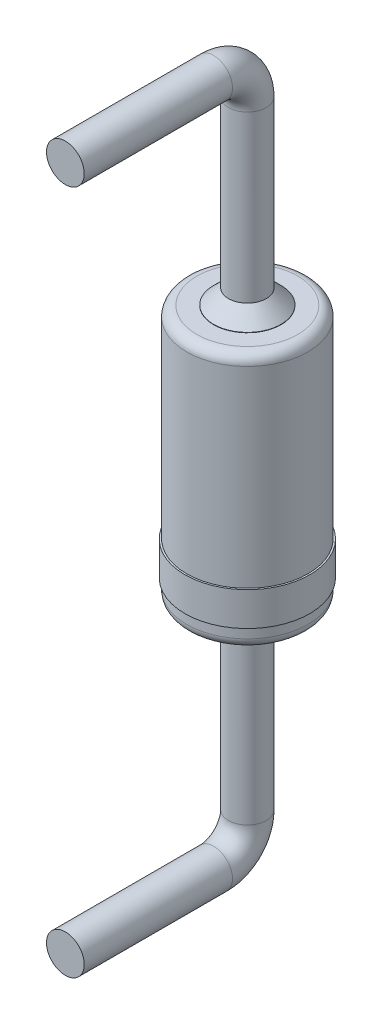
ISO-10303-21;
HEADER;
FILE_DESCRIPTION(('STEP AP214'),'2;1');
FILE_NAME('part.step','',(''),(''),'','','');
FILE_SCHEMA(('AUTOMOTIVE_DESIGN { 1 0 10303 214 1 1 1 1 }'));
ENDSEC;
DATA;
#1=APPLICATION_CONTEXT('core data for automotive mechanical design processes');
#2=APPLICATION_PROTOCOL_DEFINITION('international standard','automotive_design',2000,#1);
#3=PRODUCT_CONTEXT('',#1,'mechanical');
#4=PRODUCT('Part','Part','',(#3));
#5=PRODUCT_RELATED_PRODUCT_CATEGORY('part','',(#4));
#6=PRODUCT_DEFINITION_FORMATION('','',#4);
#7=PRODUCT_DEFINITION_CONTEXT('part definition',#1,'design');
#8=PRODUCT_DEFINITION('design','',#6,#7);
#9=PRODUCT_DEFINITION_SHAPE('','',#8);
#10=(LENGTH_UNIT() NAMED_UNIT(*) SI_UNIT(.MILLI.,.METRE.));
#11=(NAMED_UNIT(*) PLANE_ANGLE_UNIT() SI_UNIT($,.RADIAN.));
#12=(NAMED_UNIT(*) SI_UNIT($,.STERADIAN.) SOLID_ANGLE_UNIT());
#13=UNCERTAINTY_MEASURE_WITH_UNIT(LENGTH_MEASURE(1.E-05),#10,'distance_accuracy_value','');
#14=(GEOMETRIC_REPRESENTATION_CONTEXT(3) GLOBAL_UNCERTAINTY_ASSIGNED_CONTEXT((#13)) GLOBAL_UNIT_ASSIGNED_CONTEXT((#10,
#11,#12)) REPRESENTATION_CONTEXT('',''));
#15=CARTESIAN_POINT('',(0.,0.,0.));
#16=DIRECTION('',(0.,0.,1.));
#17=DIRECTION('',(1.,0.,0.));
#18=AXIS2_PLACEMENT_3D('',#15,#16,#17);
#19=CARTESIAN_POINT('',(0.,0.3,0.));
#20=DIRECTION('',(0.,1.,0.));
#21=DIRECTION('',(0.,0.,1.));
#22=AXIS2_PLACEMENT_3D('',#19,#20,#21);
#23=CYLINDRICAL_SURFACE('',#22,0.925);
#24=CARTESIAN_POINT('',(0.,0.3,0.));
#25=DIRECTION('',(0.,1.,0.));
#26=DIRECTION('',(0.,0.,1.));
#27=AXIS2_PLACEMENT_3D('',#24,#25,#26);
#28=CIRCLE('',#27,0.925);
#29=CARTESIAN_POINT('',(0.,0.3,0.925));
#30=VERTEX_POINT('',#29);
#31=EDGE_CURVE('E12',#30,#30,#28,.T.);
#32=ORIENTED_EDGE('',*,*,#31,.T.);
#33=EDGE_LOOP('',(#32));
#34=FACE_BOUND('',#33,.T.);
#35=CARTESIAN_POINT('',(0.,0.8,0.));
#36=DIRECTION('',(0.,1.,0.));
#37=DIRECTION('',(0.,0.,1.));
#38=AXIS2_PLACEMENT_3D('',#35,#36,#37);
#39=CIRCLE('',#38,0.925);
#40=CARTESIAN_POINT('',(0.,0.8,0.925));
#41=VERTEX_POINT('',#40);
#42=EDGE_CURVE('E55',#41,#41,#39,.T.);
#43=ORIENTED_EDGE('',*,*,#42,.F.);
#44=EDGE_LOOP('',(#43));
#45=FACE_BOUND('',#44,.T.);
#46=ADVANCED_FACE('F52',(#34,#45),#23,.T.);
#47=CARTESIAN_POINT('',(0.,0.3,0.));
#48=DIRECTION('',(0.,1.,0.));
#49=DIRECTION('',(0.,0.,1.));
#50=AXIS2_PLACEMENT_3D('',#47,#48,#49);
#51=PLANE('',#50);
#52=CARTESIAN_POINT('',(0.,0.3,0.));
#53=DIRECTION('',(0.,1.,0.));
#54=DIRECTION('',(0.,0.,1.));
#55=AXIS2_PLACEMENT_3D('',#52,#53,#54);
#56=CIRCLE('',#55,0.875);
#57=CARTESIAN_POINT('',(0.,0.3,0.875));
#58=VERTEX_POINT('',#57);
#59=EDGE_CURVE('E62',#58,#58,#56,.T.);
#60=ORIENTED_EDGE('',*,*,#59,.T.);
#61=EDGE_LOOP('',(#60));
#62=FACE_BOUND('',#61,.T.);
#63=ORIENTED_EDGE('',*,*,#31,.F.);
#64=EDGE_LOOP('',(#63));
#65=FACE_BOUND('',#64,.T.);
#66=ADVANCED_FACE('F70',(#62,#65),#51,.F.);
#67=CARTESIAN_POINT('',(0.,0.8,0.));
#68=DIRECTION('',(0.,1.,0.));
#69=DIRECTION('',(0.,0.,1.));
#70=AXIS2_PLACEMENT_3D('',#67,#68,#69);
#71=PLANE('',#70);
#72=CARTESIAN_POINT('',(0.,0.8,0.));
#73=DIRECTION('',(0.,1.,0.));
#74=DIRECTION('',(0.,0.,1.));
#75=AXIS2_PLACEMENT_3D('',#72,#73,#74);
#76=CIRCLE('',#75,0.875);
#77=CARTESIAN_POINT('',(0.,0.8,0.875));
#78=VERTEX_POINT('',#77);
#79=EDGE_CURVE('E64',#78,#78,#76,.T.);
#80=ORIENTED_EDGE('',*,*,#79,.F.);
#81=EDGE_LOOP('',(#80));
#82=FACE_BOUND('',#81,.T.);
#83=ORIENTED_EDGE('',*,*,#42,.T.);
#84=EDGE_LOOP('',(#83));
#85=FACE_BOUND('',#84,.T.);
#86=ADVANCED_FACE('F76',(#82,#85),#71,.T.);
#87=CARTESIAN_POINT('',(0.,0.3,0.));
#88=DIRECTION('',(0.,1.,0.));
#89=DIRECTION('',(0.,0.,1.));
#90=AXIS2_PLACEMENT_3D('',#87,#88,#89);
#91=CYLINDRICAL_SURFACE('',#90,0.875);
#92=ORIENTED_EDGE('',*,*,#59,.F.);
#93=EDGE_LOOP('',(#92));
#94=FACE_BOUND('',#93,.T.);
#95=ORIENTED_EDGE('',*,*,#79,.T.);
#96=EDGE_LOOP('',(#95));
#97=FACE_BOUND('',#96,.T.);
#98=ADVANCED_FACE('F73',(#94,#97),#91,.F.);
#99=CLOSED_SHELL('',(#46,#66,#86,#98));
#100=MANIFOLD_SOLID_BREP('B2',#99);
#101=CARTESIAN_POINT('',(0.,-0.225,0.));
#102=DIRECTION('',(0.,1.,0.));
#103=DIRECTION('',(0.,0.,-1.));
#104=AXIS2_PLACEMENT_3D('',#101,#102,#103);
#105=CYLINDRICAL_SURFACE('',#104,0.5);
#106=CARTESIAN_POINT('',(0.,-0.00499999999999893,0.));
#107=DIRECTION('',(0.,1.,0.));
#108=DIRECTION('',(0.,0.,1.));
#109=AXIS2_PLACEMENT_3D('',#106,#107,#108);
#110=CIRCLE('',#109,0.5);
#111=CARTESIAN_POINT('',(0.,-0.00499999999999893,0.5));
#112=VERTEX_POINT('',#111);
#113=EDGE_CURVE('E51',#112,#112,#110,.F.);
#114=ORIENTED_EDGE('',*,*,#113,.F.);
#115=EDGE_LOOP('',(#114));
#116=FACE_BOUND('',#115,.T.);
#117=CARTESIAN_POINT('',(0.,0.,0.));
#118=DIRECTION('',(0.,1.,0.));
#119=DIRECTION('',(0.,0.,1.));
#120=AXIS2_PLACEMENT_3D('',#117,#118,#119);
#121=CIRCLE('',#120,0.5);
#122=CARTESIAN_POINT('',(0.,0.,0.5));
#123=VERTEX_POINT('',#122);
#124=EDGE_CURVE('E129',#123,#123,#121,.T.);
#125=ORIENTED_EDGE('',*,*,#124,.F.);
#126=EDGE_LOOP('',(#125));
#127=FACE_BOUND('',#126,.T.);
#128=ADVANCED_FACE('F122',(#116,#127),#105,.T.);
#129=CARTESIAN_POINT('',(0.,0.,0.));
#130=DIRECTION('',(0.,-1.,0.));
#131=DIRECTION('',(0.,0.,1.));
#132=AXIS2_PLACEMENT_3D('',#129,#130,#131);
#133=PLANE('',#132);
#134=ORIENTED_EDGE('',*,*,#124,.T.);
#135=EDGE_LOOP('',(#134));
#136=FACE_BOUND('',#135,.T.);
#137=ADVANCED_FACE('F166',(#136),#133,.F.);
#138=CARTESIAN_POINT('',(0.,-0.225,0.));
#139=DIRECTION('',(0.,1.,0.));
#140=DIRECTION('',(0.,0.,-1.));
#141=AXIS2_PLACEMENT_3D('',#138,#139,#140);
#142=CONICAL_SURFACE('',#141,0.28,0.785398163397447);
#143=ORIENTED_EDGE('',*,*,#113,.T.);
#144=EDGE_LOOP('',(#143));
#145=FACE_BOUND('',#144,.T.);
#146=CARTESIAN_POINT('',(0.,-0.225,0.));
#147=DIRECTION('',(0.,1.,0.));
#148=DIRECTION('',(0.,0.,1.));
#149=AXIS2_PLACEMENT_3D('',#146,#147,#148);
#150=CIRCLE('',#149,0.28);
#151=CARTESIAN_POINT('',(0.,-0.225,0.28));
#152=VERTEX_POINT('',#151);
#153=EDGE_CURVE('E145',#152,#152,#150,.T.);
#154=ORIENTED_EDGE('',*,*,#153,.T.);
#155=EDGE_LOOP('',(#154));
#156=FACE_BOUND('',#155,.T.);
#157=ADVANCED_FACE('F124',(#145,#156),#142,.T.);
#158=CARTESIAN_POINT('',(0.,-3.18,2.7));
#159=DIRECTION('',(0.,0.,-1.));
#160=DIRECTION('',(0.,1.,0.));
#161=AXIS2_PLACEMENT_3D('',#158,#159,#160);
#162=PLANE('',#161);
#163=CARTESIAN_POINT('',(0.,-3.18,2.7));
#164=DIRECTION('',(0.,0.,-1.));
#165=DIRECTION('',(0.,1.,0.));
#166=AXIS2_PLACEMENT_3D('',#163,#164,#165);
#167=CIRCLE('',#166,0.28);
#168=CARTESIAN_POINT('',(0.,-2.9,2.7));
#169=VERTEX_POINT('',#168);
#170=EDGE_CURVE('E133',#169,#169,#167,.T.);
#171=ORIENTED_EDGE('',*,*,#170,.F.);
#172=EDGE_LOOP('',(#171));
#173=FACE_BOUND('',#172,.T.);
#174=ADVANCED_FACE('F153',(#173),#162,.F.);
#175=CARTESIAN_POINT('',(0.,-0.225,0.));
#176=DIRECTION('',(0.,-1.,0.));
#177=DIRECTION('',(0.,0.,-1.));
#178=AXIS2_PLACEMENT_3D('',#175,#176,#177);
#179=CYLINDRICAL_SURFACE('',#178,0.28);
#180=CARTESIAN_POINT('',(0.,-2.68,0.));
#181=DIRECTION('',(0.,1.,0.));
#182=DIRECTION('',(0.,0.,1.));
#183=AXIS2_PLACEMENT_3D('',#180,#181,#182);
#184=CIRCLE('',#183,0.28);
#185=CARTESIAN_POINT('',(0.,-2.68,-0.279999999999998));
#186=VERTEX_POINT('',#185);
#187=EDGE_CURVE('E142',#186,#186,#184,.T.);
#188=ORIENTED_EDGE('',*,*,#187,.T.);
#189=EDGE_LOOP('',(#188));
#190=FACE_BOUND('',#189,.T.);
#191=ORIENTED_EDGE('',*,*,#153,.F.);
#192=EDGE_LOOP('',(#191));
#193=FACE_BOUND('',#192,.T.);
#194=ADVANCED_FACE('F150',(#190,#193),#179,.T.);
#195=CARTESIAN_POINT('',(0.,-2.68,0.5));
#196=DIRECTION('',(-1.,0.,0.));
#197=DIRECTION('',(0.,0.,1.));
#198=AXIS2_PLACEMENT_3D('',#195,#196,#197);
#199=TOROIDAL_SURFACE('',#198,0.499999999999999,0.28);
#200=CARTESIAN_POINT('',(0.,-3.18,0.500000000000003));
#201=DIRECTION('',(0.,0.,-1.));
#202=DIRECTION('',(0.,1.,0.));
#203=AXIS2_PLACEMENT_3D('',#200,#201,#202);
#204=CIRCLE('',#203,0.28);
#205=CARTESIAN_POINT('',(0.,-3.46,0.500000000000005));
#206=VERTEX_POINT('',#205);
#207=EDGE_CURVE('E137',#206,#206,#204,.T.);
#208=CARTESIAN_POINT('',(0.,-2.68,0.5));
#209=DIRECTION('',(-1.,0.,0.));
#210=DIRECTION('',(0.,0.,1.));
#211=AXIS2_PLACEMENT_3D('',#208,#209,#210);
#212=CIRCLE('',#211,0.779999999999998);
#213=EDGE_CURVE('',#186,#206,#212,.T.);
#214=ORIENTED_EDGE('',*,*,#187,.F.);
#215=ORIENTED_EDGE('',*,*,#207,.T.);
#216=ORIENTED_EDGE('',*,*,#213,.T.);
#217=ORIENTED_EDGE('',*,*,#213,.F.);
#218=EDGE_LOOP('',(#214,#216,#215,#217));
#219=FACE_BOUND('',#218,.T.);
#220=ADVANCED_FACE('F152',(#219),#199,.T.);
#221=CARTESIAN_POINT('',(0.,-3.18,0.500000000000003));
#222=DIRECTION('',(0.,0.,1.));
#223=DIRECTION('',(1.,0.,0.));
#224=AXIS2_PLACEMENT_3D('',#221,#222,#223);
#225=CYLINDRICAL_SURFACE('',#224,0.28);
#226=ORIENTED_EDGE('',*,*,#170,.T.);
#227=EDGE_LOOP('',(#226));
#228=FACE_BOUND('',#227,.T.);
#229=ORIENTED_EDGE('',*,*,#207,.F.);
#230=EDGE_LOOP('',(#229));
#231=FACE_BOUND('',#230,.T.);
#232=ADVANCED_FACE('F160',(#228,#231),#225,.T.);
#233=CLOSED_SHELL('',(#128,#137,#157,#174,#194,#220,#232));
#234=MANIFOLD_SOLID_BREP('B7',#233);
#235=CARTESIAN_POINT('',(0.,4.025,0.));
#236=DIRECTION('',(0.,-1.,0.));
#237=DIRECTION('',(0.,0.,-1.));
#238=AXIS2_PLACEMENT_3D('',#235,#236,#237);
#239=CYLINDRICAL_SURFACE('',#238,0.5);
#240=CARTESIAN_POINT('',(0.,3.805,0.));
#241=DIRECTION('',(0.,1.,0.));
#242=DIRECTION('',(0.,0.,1.));
#243=AXIS2_PLACEMENT_3D('',#240,#241,#242);
#244=CIRCLE('',#243,0.5);
#245=CARTESIAN_POINT('',(0.,3.805,0.5));
#246=VERTEX_POINT('',#245);
#247=EDGE_CURVE('E121',#246,#246,#244,.F.);
#248=ORIENTED_EDGE('',*,*,#247,.T.);
#249=EDGE_LOOP('',(#248));
#250=FACE_BOUND('',#249,.T.);
#251=CARTESIAN_POINT('',(0.,3.8,0.));
#252=DIRECTION('',(0.,1.,0.));
#253=DIRECTION('',(0.,0.,1.));
#254=AXIS2_PLACEMENT_3D('',#251,#252,#253);
#255=CIRCLE('',#254,0.5);
#256=CARTESIAN_POINT('',(0.,3.8,0.5));
#257=VERTEX_POINT('',#256);
#258=EDGE_CURVE('E247',#257,#257,#255,.T.);
#259=ORIENTED_EDGE('',*,*,#258,.T.);
#260=EDGE_LOOP('',(#259));
#261=FACE_BOUND('',#260,.T.);
#262=ADVANCED_FACE('F236',(#250,#261),#239,.T.);
#263=CARTESIAN_POINT('',(0.,3.8,0.));
#264=DIRECTION('',(0.,1.,0.));
#265=DIRECTION('',(0.,0.,1.));
#266=AXIS2_PLACEMENT_3D('',#263,#264,#265);
#267=PLANE('',#266);
#268=ORIENTED_EDGE('',*,*,#258,.F.);
#269=EDGE_LOOP('',(#268));
#270=FACE_BOUND('',#269,.T.);
#271=ADVANCED_FACE('F279',(#270),#267,.F.);
#272=CARTESIAN_POINT('',(0.,4.025,0.));
#273=DIRECTION('',(0.,-1.,0.));
#274=DIRECTION('',(0.,0.,-1.));
#275=AXIS2_PLACEMENT_3D('',#272,#273,#274);
#276=CONICAL_SURFACE('',#275,0.28,0.785398163397447);
#277=ORIENTED_EDGE('',*,*,#247,.F.);
#278=EDGE_LOOP('',(#277));
#279=FACE_BOUND('',#278,.T.);
#280=CARTESIAN_POINT('',(0.,4.025,0.));
#281=DIRECTION('',(0.,1.,0.));
#282=DIRECTION('',(0.,0.,1.));
#283=AXIS2_PLACEMENT_3D('',#280,#281,#282);
#284=CIRCLE('',#283,0.28);
#285=CARTESIAN_POINT('',(0.,4.025,0.28));
#286=VERTEX_POINT('',#285);
#287=EDGE_CURVE('E243',#286,#286,#284,.T.);
#288=ORIENTED_EDGE('',*,*,#287,.F.);
#289=EDGE_LOOP('',(#288));
#290=FACE_BOUND('',#289,.T.);
#291=ADVANCED_FACE('F238',(#279,#290),#276,.T.);
#292=CARTESIAN_POINT('',(0.,6.98,2.7));
#293=DIRECTION('',(0.,0.,1.));
#294=DIRECTION('',(0.,-1.,0.));
#295=AXIS2_PLACEMENT_3D('',#292,#293,#294);
#296=PLANE('',#295);
#297=CARTESIAN_POINT('',(0.,6.98,2.7));
#298=DIRECTION('',(0.,0.,1.));
#299=DIRECTION('',(0.,-1.,0.));
#300=AXIS2_PLACEMENT_3D('',#297,#298,#299);
#301=CIRCLE('',#300,0.28);
#302=CARTESIAN_POINT('',(0.,6.7,2.7));
#303=VERTEX_POINT('',#302);
#304=EDGE_CURVE('E251',#303,#303,#301,.T.);
#305=ORIENTED_EDGE('',*,*,#304,.T.);
#306=EDGE_LOOP('',(#305));
#307=FACE_BOUND('',#306,.T.);
#308=ADVANCED_FACE('F267',(#307),#296,.T.);
#309=CARTESIAN_POINT('',(0.,4.025,0.));
#310=DIRECTION('',(0.,1.,0.));
#311=DIRECTION('',(0.,0.,1.));
#312=AXIS2_PLACEMENT_3D('',#309,#310,#311);
#313=CYLINDRICAL_SURFACE('',#312,0.28);
#314=CARTESIAN_POINT('',(0.,6.48,0.));
#315=DIRECTION('',(0.,1.,0.));
#316=DIRECTION('',(0.,0.,1.));
#317=AXIS2_PLACEMENT_3D('',#314,#315,#316);
#318=CIRCLE('',#317,0.28);
#319=CARTESIAN_POINT('',(0.,6.48,-0.28));
#320=VERTEX_POINT('',#319);
#321=EDGE_CURVE('E259',#320,#320,#318,.T.);
#322=ORIENTED_EDGE('',*,*,#321,.F.);
#323=EDGE_LOOP('',(#322));
#324=FACE_BOUND('',#323,.T.);
#325=ORIENTED_EDGE('',*,*,#287,.T.);
#326=EDGE_LOOP('',(#325));
#327=FACE_BOUND('',#326,.T.);
#328=ADVANCED_FACE('F265',(#324,#327),#313,.T.);
#329=CARTESIAN_POINT('',(0.,6.48,0.5));
#330=DIRECTION('',(1.,0.,0.));
#331=DIRECTION('',(0.,0.,-1.));
#332=AXIS2_PLACEMENT_3D('',#329,#330,#331);
#333=TOROIDAL_SURFACE('',#332,0.5,0.28);
#334=CARTESIAN_POINT('',(0.,6.98,0.5));
#335=DIRECTION('',(0.,0.,1.));
#336=DIRECTION('',(0.,-1.,0.));
#337=AXIS2_PLACEMENT_3D('',#334,#335,#336);
#338=CIRCLE('',#337,0.28);
#339=CARTESIAN_POINT('',(0.,7.26,0.5));
#340=VERTEX_POINT('',#339);
#341=EDGE_CURVE('E256',#340,#340,#338,.T.);
#342=CARTESIAN_POINT('',(0.,6.48,0.5));
#343=DIRECTION('',(1.,0.,0.));
#344=DIRECTION('',(0.,0.,-1.));
#345=AXIS2_PLACEMENT_3D('',#342,#343,#344);
#346=CIRCLE('',#345,0.78);
#347=EDGE_CURVE('',#320,#340,#346,.T.);
#348=ORIENTED_EDGE('',*,*,#321,.T.);
#349=ORIENTED_EDGE('',*,*,#341,.F.);
#350=ORIENTED_EDGE('',*,*,#347,.T.);
#351=ORIENTED_EDGE('',*,*,#347,.F.);
#352=EDGE_LOOP('',(#348,#350,#349,#351));
#353=FACE_BOUND('',#352,.T.);
#354=ADVANCED_FACE('F263',(#353),#333,.T.);
#355=CARTESIAN_POINT('',(0.,6.98,0.5));
#356=DIRECTION('',(0.,0.,1.));
#357=DIRECTION('',(0.,-1.,0.));
#358=AXIS2_PLACEMENT_3D('',#355,#356,#357);
#359=CYLINDRICAL_SURFACE('',#358,0.28);
#360=ORIENTED_EDGE('',*,*,#304,.F.);
#361=EDGE_LOOP('',(#360));
#362=FACE_BOUND('',#361,.T.);
#363=ORIENTED_EDGE('',*,*,#341,.T.);
#364=EDGE_LOOP('',(#363));
#365=FACE_BOUND('',#364,.T.);
#366=ADVANCED_FACE('F273',(#362,#365),#359,.T.);
#367=CLOSED_SHELL('',(#262,#271,#291,#308,#328,#354,#366));
#368=MANIFOLD_SOLID_BREP('B46',#367);
#369=CARTESIAN_POINT('',(0.,3.8,0.));
#370=DIRECTION('',(0.,-1.,0.));
#371=DIRECTION('',(0.,0.,-1.));
#372=AXIS2_PLACEMENT_3D('',#369,#370,#371);
#373=CYLINDRICAL_SURFACE('',#372,0.9);
#374=CARTESIAN_POINT('',(0.,0.15,0.));
#375=DIRECTION('',(0.,1.,0.));
#376=DIRECTION('',(0.,0.,1.));
#377=AXIS2_PLACEMENT_3D('',#374,#375,#376);
#378=CIRCLE('',#377,0.9);
#379=CARTESIAN_POINT('',(0.,0.15,-0.9));
#380=VERTEX_POINT('',#379);
#381=EDGE_CURVE('E344',#380,#380,#378,.T.);
#382=CARTESIAN_POINT('',(0.,3.65,0.));
#383=DIRECTION('',(0.,1.,0.));
#384=DIRECTION('',(0.,0.,1.));
#385=AXIS2_PLACEMENT_3D('',#382,#383,#384);
#386=CIRCLE('',#385,0.9);
#387=CARTESIAN_POINT('',(0.,3.65,-0.9));
#388=VERTEX_POINT('',#387);
#389=EDGE_CURVE('E348',#388,#388,#386,.F.);
#390=CARTESIAN_POINT('',(0.,0.15,-0.9));
#391=CARTESIAN_POINT('',(0.,0.186458333333333,-0.9));
#392=CARTESIAN_POINT('',(0.,0.222916666666667,-0.9));
#393=CARTESIAN_POINT('',(0.,0.295833333333333,-0.9));
#394=CARTESIAN_POINT('',(0.,0.332291666666667,-0.9));
#395=CARTESIAN_POINT('',(0.,0.405208333333334,-0.9));
#396=CARTESIAN_POINT('',(0.,0.441666666666667,-0.9));
#397=CARTESIAN_POINT('',(0.,0.514583333333334,-0.9));
#398=CARTESIAN_POINT('',(0.,0.551041666666667,-0.9));
#399=CARTESIAN_POINT('',(0.,0.623958333333333,-0.9));
#400=CARTESIAN_POINT('',(0.,0.660416666666667,-0.9));
#401=CARTESIAN_POINT('',(0.,0.733333333333333,-0.9));
#402=CARTESIAN_POINT('',(0.,0.769791666666667,-0.9));
#403=CARTESIAN_POINT('',(0.,0.842708333333333,-0.9));
#404=CARTESIAN_POINT('',(0.,0.879166666666667,-0.9));
#405=CARTESIAN_POINT('',(0.,0.952083333333333,-0.9));
#406=CARTESIAN_POINT('',(0.,0.988541666666667,-0.9));
#407=CARTESIAN_POINT('',(0.,1.06145833333333,-0.9));
#408=CARTESIAN_POINT('',(0.,1.09791666666667,-0.9));
#409=CARTESIAN_POINT('',(0.,1.17083333333333,-0.9));
#410=CARTESIAN_POINT('',(0.,1.20729166666667,-0.9));
#411=CARTESIAN_POINT('',(0.,1.28020833333333,-0.9));
#412=CARTESIAN_POINT('',(0.,1.31666666666667,-0.9));
#413=CARTESIAN_POINT('',(0.,1.38958333333333,-0.9));
#414=CARTESIAN_POINT('',(0.,1.42604166666667,-0.9));
#415=CARTESIAN_POINT('',(0.,1.49895833333333,-0.9));
#416=CARTESIAN_POINT('',(0.,1.53541666666667,-0.9));
#417=CARTESIAN_POINT('',(0.,1.60833333333333,-0.9));
#418=CARTESIAN_POINT('',(0.,1.64479166666667,-0.9));
#419=CARTESIAN_POINT('',(0.,1.71770833333333,-0.9));
#420=CARTESIAN_POINT('',(0.,1.75416666666667,-0.9));
#421=CARTESIAN_POINT('',(0.,1.82708333333333,-0.9));
#422=CARTESIAN_POINT('',(0.,1.86354166666667,-0.9));
#423=CARTESIAN_POINT('',(0.,1.93645833333333,-0.9));
#424=CARTESIAN_POINT('',(0.,1.97291666666667,-0.9));
#425=CARTESIAN_POINT('',(0.,2.04583333333333,-0.9));
#426=CARTESIAN_POINT('',(0.,2.08229166666667,-0.9));
#427=CARTESIAN_POINT('',(0.,2.15520833333333,-0.9));
#428=CARTESIAN_POINT('',(0.,2.19166666666667,-0.9));
#429=CARTESIAN_POINT('',(0.,2.26458333333333,-0.9));
#430=CARTESIAN_POINT('',(0.,2.30104166666667,-0.9));
#431=CARTESIAN_POINT('',(0.,2.37395833333333,-0.9));
#432=CARTESIAN_POINT('',(0.,2.41041666666667,-0.9));
#433=CARTESIAN_POINT('',(0.,2.48333333333333,-0.9));
#434=CARTESIAN_POINT('',(0.,2.51979166666667,-0.9));
#435=CARTESIAN_POINT('',(0.,2.59270833333333,-0.9));
#436=CARTESIAN_POINT('',(0.,2.62916666666667,-0.9));
#437=CARTESIAN_POINT('',(0.,2.70208333333333,-0.9));
#438=CARTESIAN_POINT('',(0.,2.73854166666667,-0.9));
#439=CARTESIAN_POINT('',(0.,2.81145833333333,-0.9));
#440=CARTESIAN_POINT('',(0.,2.84791666666667,-0.9));
#441=CARTESIAN_POINT('',(0.,2.92083333333333,-0.9));
#442=CARTESIAN_POINT('',(0.,2.95729166666667,-0.9));
#443=CARTESIAN_POINT('',(0.,3.03020833333333,-0.9));
#444=CARTESIAN_POINT('',(0.,3.06666666666667,-0.9));
#445=CARTESIAN_POINT('',(0.,3.13958333333333,-0.9));
#446=CARTESIAN_POINT('',(0.,3.17604166666667,-0.9));
#447=CARTESIAN_POINT('',(0.,3.24895833333333,-0.9));
#448=CARTESIAN_POINT('',(0.,3.28541666666667,-0.9));
#449=CARTESIAN_POINT('',(0.,3.35833333333333,-0.9));
#450=CARTESIAN_POINT('',(0.,3.39479166666667,-0.9));
#451=CARTESIAN_POINT('',(0.,3.46770833333333,-0.9));
#452=CARTESIAN_POINT('',(0.,3.50416666666667,-0.9));
#453=CARTESIAN_POINT('',(0.,3.57708333333333,-0.9));
#454=CARTESIAN_POINT('',(0.,3.61354166666667,-0.9));
#455=CARTESIAN_POINT('',(0.,3.65,-0.9));
#456=B_SPLINE_CURVE_WITH_KNOTS('',3,(#390,#391,#392,#393,#394,#395,#396,#397,#398,#399,#400,
#401,#402,#403,#404,#405,#406,#407,#408,#409,#410,#411,#412,#413,#414,#415,#416,#417,#418,#419,
#420,#421,#422,#423,#424,#425,#426,#427,#428,#429,#430,#431,#432,#433,#434,#435,#436,#437,#438,
#439,#440,#441,#442,#443,#444,#445,#446,#447,#448,#449,#450,#451,#452,#453,#454,#455),
.UNSPECIFIED.,.F.,.F.,(4,2,2,2,2,2,2,2,2,2,2,2,2,2,2,2,2,2,2,2,2,2,2,2,2,2,2,2,2,2,2,2,4),(0.,
0.109375,0.21875,0.328125,0.4375,0.546875,0.65625,0.765625,0.875,0.984375,1.09375,1.203125,
1.3125,1.421875,1.53125,1.640625,1.75,1.859375,1.96875,2.078125,2.1875,2.296875,2.40625,
2.515625,2.625,2.734375,2.84375,2.953125,3.0625,3.171875,3.28125,3.390625,3.5),.UNSPECIFIED.);
#457=EDGE_CURVE('BSEAM337',#380,#388,#456,.T.);
#458=ORIENTED_EDGE('',*,*,#381,.T.);
#459=ORIENTED_EDGE('',*,*,#389,.T.);
#460=ORIENTED_EDGE('',*,*,#457,.T.);
#461=ORIENTED_EDGE('',*,*,#457,.F.);
#462=EDGE_LOOP('',(#458,#460,#459,#461));
#463=FACE_BOUND('',#462,.T.);
#464=ADVANCED_FACE('F337',(#463),#373,.T.);
#465=CARTESIAN_POINT('',(0.,3.8,0.));
#466=DIRECTION('',(0.,1.,0.));
#467=DIRECTION('',(0.,0.,1.));
#468=AXIS2_PLACEMENT_3D('',#465,#466,#467);
#469=PLANE('',#468);
#470=CARTESIAN_POINT('',(0.,3.8,0.));
#471=DIRECTION('',(0.,1.,0.));
#472=DIRECTION('',(0.,0.,1.));
#473=AXIS2_PLACEMENT_3D('',#470,#471,#472);
#474=CIRCLE('',#473,0.75);
#475=CARTESIAN_POINT('',(0.,3.8,0.75));
#476=VERTEX_POINT('',#475);
#477=EDGE_CURVE('E352',#476,#476,#474,.T.);
#478=ORIENTED_EDGE('',*,*,#477,.T.);
#479=EDGE_LOOP('',(#478));
#480=FACE_BOUND('',#479,.T.);
#481=ADVANCED_FACE('F358',(#480),#469,.T.);
#482=CARTESIAN_POINT('',(0.,0.,0.));
#483=DIRECTION('',(0.,1.,0.));
#484=DIRECTION('',(0.,0.,1.));
#485=AXIS2_PLACEMENT_3D('',#482,#483,#484);
#486=PLANE('',#485);
#487=CARTESIAN_POINT('',(0.,0.,0.));
#488=DIRECTION('',(0.,1.,0.));
#489=DIRECTION('',(0.,0.,1.));
#490=AXIS2_PLACEMENT_3D('',#487,#488,#489);
#491=CIRCLE('',#490,0.75);
#492=CARTESIAN_POINT('',(0.,0.,0.75));
#493=VERTEX_POINT('',#492);
#494=EDGE_CURVE('E235',#493,#493,#491,.F.);
#495=ORIENTED_EDGE('',*,*,#494,.T.);
#496=EDGE_LOOP('',(#495));
#497=FACE_BOUND('',#496,.T.);
#498=ADVANCED_FACE('F362',(#497),#486,.F.);
#499=CARTESIAN_POINT('',(0.,3.65,0.));
#500=DIRECTION('',(0.,1.,0.));
#501=DIRECTION('',(0.,0.,1.));
#502=AXIS2_PLACEMENT_3D('',#499,#500,#501);
#503=TOROIDAL_SURFACE('',#502,0.75,0.15);
#504=ORIENTED_EDGE('',*,*,#389,.F.);
#505=EDGE_LOOP('',(#504));
#506=FACE_BOUND('',#505,.T.);
#507=ORIENTED_EDGE('',*,*,#477,.F.);
#508=EDGE_LOOP('',(#507));
#509=FACE_BOUND('',#508,.T.);
#510=ADVANCED_FACE('F360',(#506,#509),#503,.T.);
#511=CARTESIAN_POINT('',(0.,0.15,0.));
#512=DIRECTION('',(0.,1.,0.));
#513=DIRECTION('',(0.,0.,1.));
#514=AXIS2_PLACEMENT_3D('',#511,#512,#513);
#515=TOROIDAL_SURFACE('',#514,0.75,0.15);
#516=ORIENTED_EDGE('',*,*,#494,.F.);
#517=EDGE_LOOP('',(#516));
#518=FACE_BOUND('',#517,.T.);
#519=ORIENTED_EDGE('',*,*,#381,.F.);
#520=EDGE_LOOP('',(#519));
#521=FACE_BOUND('',#520,.T.);
#522=ADVANCED_FACE('F339',(#518,#521),#515,.T.);
#523=CLOSED_SHELL('',(#464,#481,#498,#510,#522));
#524=MANIFOLD_SOLID_BREP('B116',#523);
#525=ADVANCED_BREP_SHAPE_REPRESENTATION('',(#18,#100,#234,#368,#524),#14);
#526=SHAPE_DEFINITION_REPRESENTATION(#9,#525);
ENDSEC;
END-ISO-10303-21;
